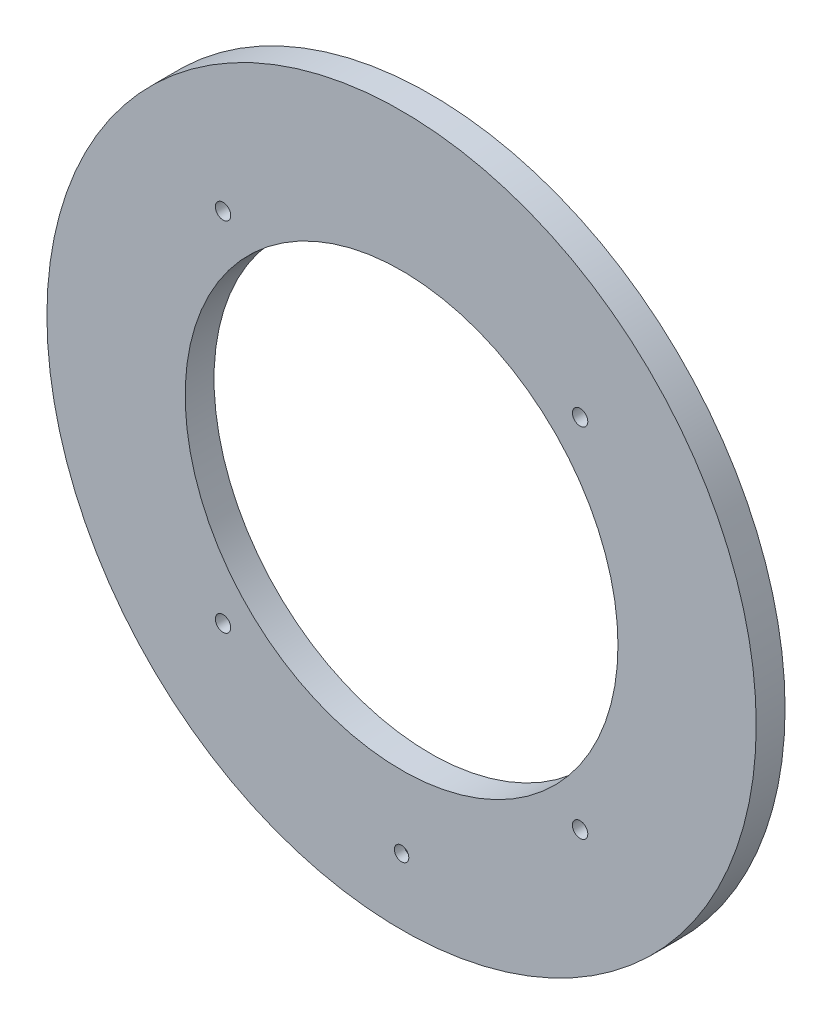
ISO-10303-21;
HEADER;
FILE_DESCRIPTION(('STEP AP214'),'2;1');
FILE_NAME('part.step','',(''),(''),'','','');
FILE_SCHEMA(('AUTOMOTIVE_DESIGN { 1 0 10303 214 1 1 1 1 }'));
ENDSEC;
DATA;
#1=APPLICATION_CONTEXT('core data for automotive mechanical design processes');
#2=APPLICATION_PROTOCOL_DEFINITION('international standard','automotive_design',2000,#1);
#3=PRODUCT_CONTEXT('',#1,'mechanical');
#4=PRODUCT('Part','Part','',(#3));
#5=PRODUCT_RELATED_PRODUCT_CATEGORY('part','',(#4));
#6=PRODUCT_DEFINITION_FORMATION('','',#4);
#7=PRODUCT_DEFINITION_CONTEXT('part definition',#1,'design');
#8=PRODUCT_DEFINITION('design','',#6,#7);
#9=PRODUCT_DEFINITION_SHAPE('','',#8);
#10=(LENGTH_UNIT() NAMED_UNIT(*) SI_UNIT(.MILLI.,.METRE.));
#11=(NAMED_UNIT(*) PLANE_ANGLE_UNIT() SI_UNIT($,.RADIAN.));
#12=(NAMED_UNIT(*) SI_UNIT($,.STERADIAN.) SOLID_ANGLE_UNIT());
#13=UNCERTAINTY_MEASURE_WITH_UNIT(LENGTH_MEASURE(1.E-05),#10,'distance_accuracy_value','');
#14=(GEOMETRIC_REPRESENTATION_CONTEXT(3) GLOBAL_UNCERTAINTY_ASSIGNED_CONTEXT((#13)) GLOBAL_UNIT_ASSIGNED_CONTEXT((#10,
#11,#12)) REPRESENTATION_CONTEXT('',''));
#15=CARTESIAN_POINT('',(0.,0.,0.));
#16=DIRECTION('',(0.,0.,1.));
#17=DIRECTION('',(1.,0.,0.));
#18=AXIS2_PLACEMENT_3D('',#15,#16,#17);
#19=CARTESIAN_POINT('',(0.,0.,12.));
#20=DIRECTION('',(0.,0.,-1.));
#21=DIRECTION('',(-1.,0.,0.));
#22=AXIS2_PLACEMENT_3D('',#19,#20,#21);
#23=CYLINDRICAL_SURFACE('',#22,90.);
#24=CARTESIAN_POINT('',(0.,0.,12.));
#25=DIRECTION('',(0.,0.,1.));
#26=DIRECTION('',(1.,0.,0.));
#27=AXIS2_PLACEMENT_3D('',#24,#25,#26);
#28=CIRCLE('',#27,90.);
#29=CARTESIAN_POINT('',(90.,0.,12.));
#30=VERTEX_POINT('',#29);
#31=EDGE_CURVE('E50',#30,#30,#28,.T.);
#32=ORIENTED_EDGE('',*,*,#31,.T.);
#33=EDGE_LOOP('',(#32));
#34=FACE_BOUND('',#33,.T.);
#35=CARTESIAN_POINT('',(0.,0.,0.));
#36=DIRECTION('',(0.,0.,1.));
#37=DIRECTION('',(1.,0.,0.));
#38=AXIS2_PLACEMENT_3D('',#35,#36,#37);
#39=CIRCLE('',#38,90.);
#40=CARTESIAN_POINT('',(90.,0.,0.));
#41=VERTEX_POINT('',#40);
#42=EDGE_CURVE('E177',#41,#41,#39,.T.);
#43=ORIENTED_EDGE('',*,*,#42,.F.);
#44=EDGE_LOOP('',(#43));
#45=FACE_BOUND('',#44,.T.);
#46=ADVANCED_FACE('F41',(#34,#45),#23,.F.);
#47=CARTESIAN_POINT('',(0.,0.,12.));
#48=DIRECTION('',(0.,0.,-1.));
#49=DIRECTION('',(-1.,0.,0.));
#50=AXIS2_PLACEMENT_3D('',#47,#48,#49);
#51=CYLINDRICAL_SURFACE('',#50,147.5);
#52=CARTESIAN_POINT('',(0.,0.,12.));
#53=DIRECTION('',(0.,0.,1.));
#54=DIRECTION('',(1.,0.,0.));
#55=AXIS2_PLACEMENT_3D('',#52,#53,#54);
#56=CIRCLE('',#55,147.5);
#57=CARTESIAN_POINT('',(147.5,0.,12.));
#58=VERTEX_POINT('',#57);
#59=EDGE_CURVE('E11',#58,#58,#56,.T.);
#60=ORIENTED_EDGE('',*,*,#59,.F.);
#61=EDGE_LOOP('',(#60));
#62=FACE_BOUND('',#61,.T.);
#63=CARTESIAN_POINT('',(0.,0.,0.));
#64=DIRECTION('',(0.,0.,1.));
#65=DIRECTION('',(1.,0.,0.));
#66=AXIS2_PLACEMENT_3D('',#63,#64,#65);
#67=CIRCLE('',#66,147.5);
#68=CARTESIAN_POINT('',(147.5,0.,0.));
#69=VERTEX_POINT('',#68);
#70=EDGE_CURVE('E44',#69,#69,#67,.T.);
#71=ORIENTED_EDGE('',*,*,#70,.T.);
#72=EDGE_LOOP('',(#71));
#73=FACE_BOUND('',#72,.T.);
#74=ADVANCED_FACE('F196',(#62,#73),#51,.T.);
#75=CARTESIAN_POINT('',(0.,0.,12.));
#76=DIRECTION('',(0.,0.,1.));
#77=DIRECTION('',(1.,0.,0.));
#78=AXIS2_PLACEMENT_3D('',#75,#76,#77);
#79=PLANE('',#78);
#80=CARTESIAN_POINT('',(-74.2462120245883,74.2462120245867,12.));
#81=DIRECTION('',(0.,0.,1.));
#82=DIRECTION('',(1.,0.,0.));
#83=AXIS2_PLACEMENT_3D('',#80,#81,#82);
#84=CIRCLE('',#83,3.19999999999999);
#85=CARTESIAN_POINT('',(-71.0462120245883,74.2462120245867,12.));
#86=VERTEX_POINT('',#85);
#87=EDGE_CURVE('E109',#86,#86,#84,.T.);
#88=ORIENTED_EDGE('',*,*,#87,.F.);
#89=EDGE_LOOP('',(#88));
#90=FACE_BOUND('',#89,.T.);
#91=CARTESIAN_POINT('',(74.2462120245875,74.2462120245875,12.));
#92=DIRECTION('',(0.,0.,1.));
#93=DIRECTION('',(1.,0.,0.));
#94=AXIS2_PLACEMENT_3D('',#91,#92,#93);
#95=CIRCLE('',#94,3.19999999999999);
#96=CARTESIAN_POINT('',(77.4462120245875,74.2462120245875,12.));
#97=VERTEX_POINT('',#96);
#98=EDGE_CURVE('E108',#97,#97,#95,.T.);
#99=ORIENTED_EDGE('',*,*,#98,.F.);
#100=EDGE_LOOP('',(#99));
#101=FACE_BOUND('',#100,.T.);
#102=CARTESIAN_POINT('',(74.2462120245877,-74.2462120245872,12.));
#103=DIRECTION('',(0.,0.,1.));
#104=DIRECTION('',(1.,0.,0.));
#105=AXIS2_PLACEMENT_3D('',#102,#103,#104);
#106=CIRCLE('',#105,3.19999999999999);
#107=CARTESIAN_POINT('',(77.4462120245877,-74.2462120245872,12.));
#108=VERTEX_POINT('',#107);
#109=EDGE_CURVE('E122',#108,#108,#106,.T.);
#110=ORIENTED_EDGE('',*,*,#109,.F.);
#111=EDGE_LOOP('',(#110));
#112=FACE_BOUND('',#111,.T.);
#113=CARTESIAN_POINT('',(-74.2462120245875,-74.2462120245875,12.));
#114=DIRECTION('',(0.,0.,1.));
#115=DIRECTION('',(1.,0.,0.));
#116=AXIS2_PLACEMENT_3D('',#113,#114,#115);
#117=CIRCLE('',#116,3.19999999999999);
#118=CARTESIAN_POINT('',(-71.0462120245875,-74.2462120245875,12.));
#119=VERTEX_POINT('',#118);
#120=EDGE_CURVE('E130',#119,#119,#117,.T.);
#121=ORIENTED_EDGE('',*,*,#120,.F.);
#122=EDGE_LOOP('',(#121));
#123=FACE_BOUND('',#122,.T.);
#124=CARTESIAN_POINT('',(0.,-120.,12.));
#125=DIRECTION('',(0.,0.,1.));
#126=DIRECTION('',(1.,0.,0.));
#127=AXIS2_PLACEMENT_3D('',#124,#125,#126);
#128=CIRCLE('',#127,3.);
#129=CARTESIAN_POINT('',(2.99999999999999,-120.,12.));
#130=VERTEX_POINT('',#129);
#131=EDGE_CURVE('E142',#130,#130,#128,.F.);
#132=ORIENTED_EDGE('',*,*,#131,.T.);
#133=EDGE_LOOP('',(#132));
#134=FACE_BOUND('',#133,.T.);
#135=ORIENTED_EDGE('',*,*,#31,.F.);
#136=EDGE_LOOP('',(#135));
#137=FACE_BOUND('',#136,.T.);
#138=ORIENTED_EDGE('',*,*,#59,.T.);
#139=EDGE_LOOP('',(#138));
#140=FACE_BOUND('',#139,.T.);
#141=ADVANCED_FACE('F201',(#90,#101,#112,#123,#134,#137,#140),#79,.T.);
#142=CARTESIAN_POINT('',(0.,0.,0.));
#143=DIRECTION('',(0.,0.,1.));
#144=DIRECTION('',(1.,0.,0.));
#145=AXIS2_PLACEMENT_3D('',#142,#143,#144);
#146=PLANE('',#145);
#147=CARTESIAN_POINT('',(107.903670479658,-52.5052178075421,0.));
#148=DIRECTION('',(0.,0.,-1.));
#149=DIRECTION('',(-1.,0.,0.));
#150=AXIS2_PLACEMENT_3D('',#147,#148,#149);
#151=CIRCLE('',#150,9.99999999999998);
#152=CARTESIAN_POINT('',(98.9116979396863,-48.1297829902469,0.));
#153=VERTEX_POINT('',#152);
#154=CARTESIAN_POINT('',(116.895643019629,-56.8806526248373,0.));
#155=VERTEX_POINT('',#154);
#156=EDGE_CURVE('E165',#153,#155,#151,.T.);
#157=ORIENTED_EDGE('',*,*,#156,.F.);
#158=CARTESIAN_POINT('',(0.,0.,0.));
#159=DIRECTION('',(0.,0.,1.));
#160=DIRECTION('',(-1.,0.,0.));
#161=AXIS2_PLACEMENT_3D('',#158,#159,#160);
#162=CIRCLE('',#161,110.);
#163=CARTESIAN_POINT('',(-70.7066370655186,84.2648887430882,0.));
#164=VERTEX_POINT('',#163);
#165=EDGE_CURVE('E58',#164,#153,#162,.T.);
#166=ORIENTED_EDGE('',*,*,#165,.F.);
#167=CARTESIAN_POINT('',(-77.1345131623839,91.9253331742781,0.));
#168=DIRECTION('',(0.,0.,-1.));
#169=DIRECTION('',(-1.,0.,0.));
#170=AXIS2_PLACEMENT_3D('',#167,#168,#169);
#171=CIRCLE('',#170,9.99999999999998);
#172=CARTESIAN_POINT('',(-83.5623892592493,99.5857776054679,0.));
#173=VERTEX_POINT('',#172);
#174=EDGE_CURVE('E151',#173,#164,#171,.T.);
#175=ORIENTED_EDGE('',*,*,#174,.F.);
#176=CARTESIAN_POINT('',(0.,0.,0.));
#177=DIRECTION('',(0.,0.,-1.));
#178=DIRECTION('',(-1.,0.,0.));
#179=AXIS2_PLACEMENT_3D('',#176,#177,#178);
#180=CIRCLE('',#179,130.);
#181=EDGE_CURVE('E169',#155,#173,#180,.T.);
#182=ORIENTED_EDGE('',*,*,#181,.F.);
#183=EDGE_LOOP('',(#157,#166,#175,#182));
#184=FACE_BOUND('',#183,.T.);
#185=ORIENTED_EDGE('',*,*,#42,.T.);
#186=EDGE_LOOP('',(#185));
#187=FACE_BOUND('',#186,.T.);
#188=ORIENTED_EDGE('',*,*,#70,.F.);
#189=EDGE_LOOP('',(#188));
#190=FACE_BOUND('',#189,.T.);
#191=ADVANCED_FACE('F198',(#184,#187,#190),#146,.F.);
#192=CARTESIAN_POINT('',(0.,0.,8.));
#193=DIRECTION('',(0.,0.,-1.));
#194=DIRECTION('',(-1.,0.,0.));
#195=AXIS2_PLACEMENT_3D('',#192,#193,#194);
#196=CYLINDRICAL_SURFACE('',#195,110.);
#197=ORIENTED_EDGE('',*,*,#165,.T.);
#198=DIRECTION('',(0.,0.,-1.));
#199=VECTOR('',#198,1.);
#200=CARTESIAN_POINT('',(98.9116979396863,-48.1297829902469,8.));
#201=LINE('',#200,#199);
#202=CARTESIAN_POINT('',(98.9116979396863,-48.1297829902469,8.));
#203=VERTEX_POINT('',#202);
#204=EDGE_CURVE('E82',#203,#153,#201,.T.);
#205=ORIENTED_EDGE('',*,*,#204,.F.);
#206=CARTESIAN_POINT('',(0.,0.,8.));
#207=DIRECTION('',(0.,0.,1.));
#208=DIRECTION('',(-1.,0.,0.));
#209=AXIS2_PLACEMENT_3D('',#206,#207,#208);
#210=CIRCLE('',#209,110.);
#211=CARTESIAN_POINT('',(-70.7066370655186,84.2648887430882,8.));
#212=VERTEX_POINT('',#211);
#213=EDGE_CURVE('E146',#212,#203,#210,.T.);
#214=ORIENTED_EDGE('',*,*,#213,.F.);
#215=DIRECTION('',(0.,0.,-1.));
#216=VECTOR('',#215,1.);
#217=CARTESIAN_POINT('',(-70.7066370655186,84.2648887430882,8.));
#218=LINE('',#217,#216);
#219=EDGE_CURVE('E66',#212,#164,#218,.T.);
#220=ORIENTED_EDGE('',*,*,#219,.T.);
#221=EDGE_LOOP('',(#197,#205,#214,#220));
#222=FACE_BOUND('',#221,.T.);
#223=ADVANCED_FACE('F200',(#222),#196,.T.);
#224=CARTESIAN_POINT('',(-77.1345131623839,91.9253331742781,8.));
#225=DIRECTION('',(0.,0.,-1.));
#226=DIRECTION('',(-1.,0.,0.));
#227=AXIS2_PLACEMENT_3D('',#224,#225,#226);
#228=CYLINDRICAL_SURFACE('',#227,9.99999999999998);
#229=ORIENTED_EDGE('',*,*,#174,.T.);
#230=ORIENTED_EDGE('',*,*,#219,.F.);
#231=CARTESIAN_POINT('',(-77.1345131623839,91.9253331742781,8.));
#232=DIRECTION('',(0.,0.,-1.));
#233=DIRECTION('',(-1.,0.,0.));
#234=AXIS2_PLACEMENT_3D('',#231,#232,#233);
#235=CIRCLE('',#234,9.99999999999998);
#236=CARTESIAN_POINT('',(-83.5623892592493,99.5857776054679,8.));
#237=VERTEX_POINT('',#236);
#238=EDGE_CURVE('E159',#237,#212,#235,.T.);
#239=ORIENTED_EDGE('',*,*,#238,.F.);
#240=DIRECTION('',(0.,0.,-1.));
#241=VECTOR('',#240,1.);
#242=CARTESIAN_POINT('',(-83.5623892592493,99.5857776054679,8.));
#243=LINE('',#242,#241);
#244=EDGE_CURVE('E178',#237,#173,#243,.T.);
#245=ORIENTED_EDGE('',*,*,#244,.T.);
#246=EDGE_LOOP('',(#229,#230,#239,#245));
#247=FACE_BOUND('',#246,.T.);
#248=ADVANCED_FACE('F208',(#247),#228,.F.);
#249=CARTESIAN_POINT('',(0.,0.,8.));
#250=DIRECTION('',(0.,0.,-1.));
#251=DIRECTION('',(-1.,0.,0.));
#252=AXIS2_PLACEMENT_3D('',#249,#250,#251);
#253=CYLINDRICAL_SURFACE('',#252,130.);
#254=ORIENTED_EDGE('',*,*,#181,.T.);
#255=ORIENTED_EDGE('',*,*,#244,.F.);
#256=CARTESIAN_POINT('',(0.,0.,8.));
#257=DIRECTION('',(0.,0.,-1.));
#258=DIRECTION('',(-1.,0.,0.));
#259=AXIS2_PLACEMENT_3D('',#256,#257,#258);
#260=CIRCLE('',#259,130.);
#261=CARTESIAN_POINT('',(116.895643019629,-56.8806526248373,8.));
#262=VERTEX_POINT('',#261);
#263=EDGE_CURVE('E155',#262,#237,#260,.T.);
#264=ORIENTED_EDGE('',*,*,#263,.F.);
#265=DIRECTION('',(0.,0.,-1.));
#266=VECTOR('',#265,1.);
#267=CARTESIAN_POINT('',(116.895643019629,-56.8806526248373,8.));
#268=LINE('',#267,#266);
#269=EDGE_CURVE('E181',#262,#155,#268,.T.);
#270=ORIENTED_EDGE('',*,*,#269,.T.);
#271=EDGE_LOOP('',(#254,#255,#264,#270));
#272=FACE_BOUND('',#271,.T.);
#273=ADVANCED_FACE('F313',(#272),#253,.F.);
#274=CARTESIAN_POINT('',(107.903670479658,-52.5052178075421,8.));
#275=DIRECTION('',(0.,0.,-1.));
#276=DIRECTION('',(-1.,0.,0.));
#277=AXIS2_PLACEMENT_3D('',#274,#275,#276);
#278=CYLINDRICAL_SURFACE('',#277,9.99999999999998);
#279=ORIENTED_EDGE('',*,*,#156,.T.);
#280=ORIENTED_EDGE('',*,*,#269,.F.);
#281=CARTESIAN_POINT('',(107.903670479658,-52.5052178075421,8.));
#282=DIRECTION('',(0.,0.,-1.));
#283=DIRECTION('',(-1.,0.,0.));
#284=AXIS2_PLACEMENT_3D('',#281,#282,#283);
#285=CIRCLE('',#284,9.99999999999998);
#286=EDGE_CURVE('E150',#203,#262,#285,.T.);
#287=ORIENTED_EDGE('',*,*,#286,.F.);
#288=ORIENTED_EDGE('',*,*,#204,.T.);
#289=EDGE_LOOP('',(#279,#280,#287,#288));
#290=FACE_BOUND('',#289,.T.);
#291=ADVANCED_FACE('F309',(#290),#278,.F.);
#292=CARTESIAN_POINT('',(-38.567256581192,45.962666587139,8.));
#293=DIRECTION('',(0.,0.,-1.));
#294=DIRECTION('',(-1.,0.,0.));
#295=AXIS2_PLACEMENT_3D('',#292,#293,#294);
#296=PLANE('',#295);
#297=CARTESIAN_POINT('',(0.,-120.,8.));
#298=DIRECTION('',(0.,0.,-1.));
#299=DIRECTION('',(-1.,0.,0.));
#300=AXIS2_PLACEMENT_3D('',#297,#298,#299);
#301=CIRCLE('',#300,3.);
#302=CARTESIAN_POINT('',(-3.00000000000002,-120.,8.));
#303=VERTEX_POINT('',#302);
#304=EDGE_CURVE('E138',#303,#303,#301,.T.);
#305=ORIENTED_EDGE('',*,*,#304,.F.);
#306=EDGE_LOOP('',(#305));
#307=FACE_BOUND('',#306,.T.);
#308=ORIENTED_EDGE('',*,*,#213,.T.);
#309=ORIENTED_EDGE('',*,*,#286,.T.);
#310=ORIENTED_EDGE('',*,*,#263,.T.);
#311=ORIENTED_EDGE('',*,*,#238,.T.);
#312=EDGE_LOOP('',(#308,#309,#310,#311));
#313=FACE_BOUND('',#312,.T.);
#314=ADVANCED_FACE('F305',(#307,#313),#296,.T.);
#315=CARTESIAN_POINT('',(0.,-120.,20.4852813742386));
#316=DIRECTION('',(0.,0.,-1.));
#317=DIRECTION('',(-1.,0.,0.));
#318=AXIS2_PLACEMENT_3D('',#315,#316,#317);
#319=CYLINDRICAL_SURFACE('',#318,3.);
#320=ORIENTED_EDGE('',*,*,#304,.T.);
#321=EDGE_LOOP('',(#320));
#322=FACE_BOUND('',#321,.T.);
#323=ORIENTED_EDGE('',*,*,#131,.F.);
#324=EDGE_LOOP('',(#323));
#325=FACE_BOUND('',#324,.T.);
#326=ADVANCED_FACE('F301',(#322,#325),#319,.F.);
#327=CARTESIAN_POINT('',(-74.2462120245875,-74.2462120245875,6.));
#328=DIRECTION('',(0.,0.,1.));
#329=DIRECTION('',(1.,0.,0.));
#330=AXIS2_PLACEMENT_3D('',#327,#328,#329);
#331=CONICAL_SURFACE('',#330,3.19999999999999,1.02974425867665);
#332=CARTESIAN_POINT('',(-74.2462120245875,-74.2462120245875,4.07724601911181));
#333=VERTEX_POINT('',#332);
#334=VERTEX_LOOP('',#333);
#335=FACE_BOUND('',#334,.T.);
#336=CARTESIAN_POINT('',(-74.2462120245875,-74.2462120245875,6.));
#337=DIRECTION('',(0.,0.,1.));
#338=DIRECTION('',(1.,0.,0.));
#339=AXIS2_PLACEMENT_3D('',#336,#337,#338);
#340=CIRCLE('',#339,3.19999999999999);
#341=CARTESIAN_POINT('',(-71.0462120245875,-74.2462120245875,6.));
#342=VERTEX_POINT('',#341);
#343=EDGE_CURVE('E134',#342,#342,#340,.T.);
#344=ORIENTED_EDGE('',*,*,#343,.T.);
#345=EDGE_LOOP('',(#344));
#346=FACE_BOUND('',#345,.T.);
#347=ADVANCED_FACE('F297',(#335,#346),#331,.F.);
#348=CARTESIAN_POINT('',(-74.2462120245875,-74.2462120245875,12.));
#349=DIRECTION('',(0.,0.,1.));
#350=DIRECTION('',(1.,0.,0.));
#351=AXIS2_PLACEMENT_3D('',#348,#349,#350);
#352=CYLINDRICAL_SURFACE('',#351,3.19999999999999);
#353=ORIENTED_EDGE('',*,*,#343,.F.);
#354=EDGE_LOOP('',(#353));
#355=FACE_BOUND('',#354,.T.);
#356=ORIENTED_EDGE('',*,*,#120,.T.);
#357=EDGE_LOOP('',(#356));
#358=FACE_BOUND('',#357,.T.);
#359=ADVANCED_FACE('F237',(#355,#358),#352,.F.);
#360=CARTESIAN_POINT('',(74.2462120245877,-74.2462120245872,6.));
#361=DIRECTION('',(0.,0.,1.));
#362=DIRECTION('',(1.,0.,0.));
#363=AXIS2_PLACEMENT_3D('',#360,#361,#362);
#364=CONICAL_SURFACE('',#363,3.19999999999999,1.02974425867665);
#365=CARTESIAN_POINT('',(74.2462120245877,-74.2462120245872,4.07724601911181));
#366=VERTEX_POINT('',#365);
#367=VERTEX_LOOP('',#366);
#368=FACE_BOUND('',#367,.T.);
#369=CARTESIAN_POINT('',(74.2462120245877,-74.2462120245872,6.));
#370=DIRECTION('',(0.,0.,1.));
#371=DIRECTION('',(1.,0.,0.));
#372=AXIS2_PLACEMENT_3D('',#369,#370,#371);
#373=CIRCLE('',#372,3.19999999999999);
#374=CARTESIAN_POINT('',(77.4462120245877,-74.2462120245872,6.));
#375=VERTEX_POINT('',#374);
#376=EDGE_CURVE('E126',#375,#375,#373,.T.);
#377=ORIENTED_EDGE('',*,*,#376,.T.);
#378=EDGE_LOOP('',(#377));
#379=FACE_BOUND('',#378,.T.);
#380=ADVANCED_FACE('F242',(#368,#379),#364,.F.);
#381=CARTESIAN_POINT('',(74.2462120245877,-74.2462120245872,12.));
#382=DIRECTION('',(0.,0.,1.));
#383=DIRECTION('',(1.,0.,0.));
#384=AXIS2_PLACEMENT_3D('',#381,#382,#383);
#385=CYLINDRICAL_SURFACE('',#384,3.19999999999999);
#386=ORIENTED_EDGE('',*,*,#376,.F.);
#387=EDGE_LOOP('',(#386));
#388=FACE_BOUND('',#387,.T.);
#389=ORIENTED_EDGE('',*,*,#109,.T.);
#390=EDGE_LOOP('',(#389));
#391=FACE_BOUND('',#390,.T.);
#392=ADVANCED_FACE('F247',(#388,#391),#385,.F.);
#393=CARTESIAN_POINT('',(74.2462120245875,74.2462120245875,6.));
#394=DIRECTION('',(0.,0.,1.));
#395=DIRECTION('',(1.,0.,0.));
#396=AXIS2_PLACEMENT_3D('',#393,#394,#395);
#397=CONICAL_SURFACE('',#396,3.19999999999999,1.02974425867665);
#398=CARTESIAN_POINT('',(74.2462120245875,74.2462120245875,4.07724601911181));
#399=VERTEX_POINT('',#398);
#400=VERTEX_LOOP('',#399);
#401=FACE_BOUND('',#400,.T.);
#402=CARTESIAN_POINT('',(74.2462120245875,74.2462120245875,6.));
#403=DIRECTION('',(0.,0.,1.));
#404=DIRECTION('',(1.,0.,0.));
#405=AXIS2_PLACEMENT_3D('',#402,#403,#404);
#406=CIRCLE('',#405,3.19999999999999);
#407=CARTESIAN_POINT('',(77.4462120245875,74.2462120245875,6.));
#408=VERTEX_POINT('',#407);
#409=EDGE_CURVE('E114',#408,#408,#406,.T.);
#410=ORIENTED_EDGE('',*,*,#409,.T.);
#411=EDGE_LOOP('',(#410));
#412=FACE_BOUND('',#411,.T.);
#413=ADVANCED_FACE('F257',(#401,#412),#397,.F.);
#414=CARTESIAN_POINT('',(74.2462120245875,74.2462120245875,12.));
#415=DIRECTION('',(0.,0.,1.));
#416=DIRECTION('',(1.,0.,0.));
#417=AXIS2_PLACEMENT_3D('',#414,#415,#416);
#418=CYLINDRICAL_SURFACE('',#417,3.19999999999999);
#419=ORIENTED_EDGE('',*,*,#409,.F.);
#420=EDGE_LOOP('',(#419));
#421=FACE_BOUND('',#420,.T.);
#422=ORIENTED_EDGE('',*,*,#98,.T.);
#423=EDGE_LOOP('',(#422));
#424=FACE_BOUND('',#423,.T.);
#425=ADVANCED_FACE('F101',(#421,#424),#418,.F.);
#426=CARTESIAN_POINT('',(-74.2462120245883,74.2462120245867,6.));
#427=DIRECTION('',(0.,0.,1.));
#428=DIRECTION('',(1.,0.,0.));
#429=AXIS2_PLACEMENT_3D('',#426,#427,#428);
#430=CONICAL_SURFACE('',#429,3.19999999999999,1.02974425867665);
#431=CARTESIAN_POINT('',(-74.2462120245883,74.2462120245867,4.07724601911181));
#432=VERTEX_POINT('',#431);
#433=VERTEX_LOOP('',#432);
#434=FACE_BOUND('',#433,.T.);
#435=CARTESIAN_POINT('',(-74.2462120245883,74.2462120245867,6.));
#436=DIRECTION('',(0.,0.,1.));
#437=DIRECTION('',(1.,0.,0.));
#438=AXIS2_PLACEMENT_3D('',#435,#436,#437);
#439=CIRCLE('',#438,3.19999999999999);
#440=CARTESIAN_POINT('',(-71.0462120245883,74.2462120245867,6.));
#441=VERTEX_POINT('',#440);
#442=EDGE_CURVE('E105',#441,#441,#439,.T.);
#443=ORIENTED_EDGE('',*,*,#442,.T.);
#444=EDGE_LOOP('',(#443));
#445=FACE_BOUND('',#444,.T.);
#446=ADVANCED_FACE('F97',(#434,#445),#430,.F.);
#447=CARTESIAN_POINT('',(-74.2462120245883,74.2462120245867,12.));
#448=DIRECTION('',(0.,0.,1.));
#449=DIRECTION('',(1.,0.,0.));
#450=AXIS2_PLACEMENT_3D('',#447,#448,#449);
#451=CYLINDRICAL_SURFACE('',#450,3.19999999999999);
#452=ORIENTED_EDGE('',*,*,#442,.F.);
#453=EDGE_LOOP('',(#452));
#454=FACE_BOUND('',#453,.T.);
#455=ORIENTED_EDGE('',*,*,#87,.T.);
#456=EDGE_LOOP('',(#455));
#457=FACE_BOUND('',#456,.T.);
#458=ADVANCED_FACE('F100',(#454,#457),#451,.F.);
#459=CLOSED_SHELL('',(#46,#74,#141,#191,#223,#248,#273,#291,#314,#326,#347,#359,#380,#392,#413,
#425,#446,#458));
#460=MANIFOLD_SOLID_BREP('B2',#459);
#461=ADVANCED_BREP_SHAPE_REPRESENTATION('',(#18,#460),#14);
#462=SHAPE_DEFINITION_REPRESENTATION(#9,#461);
ENDSEC;
END-ISO-10303-21;
